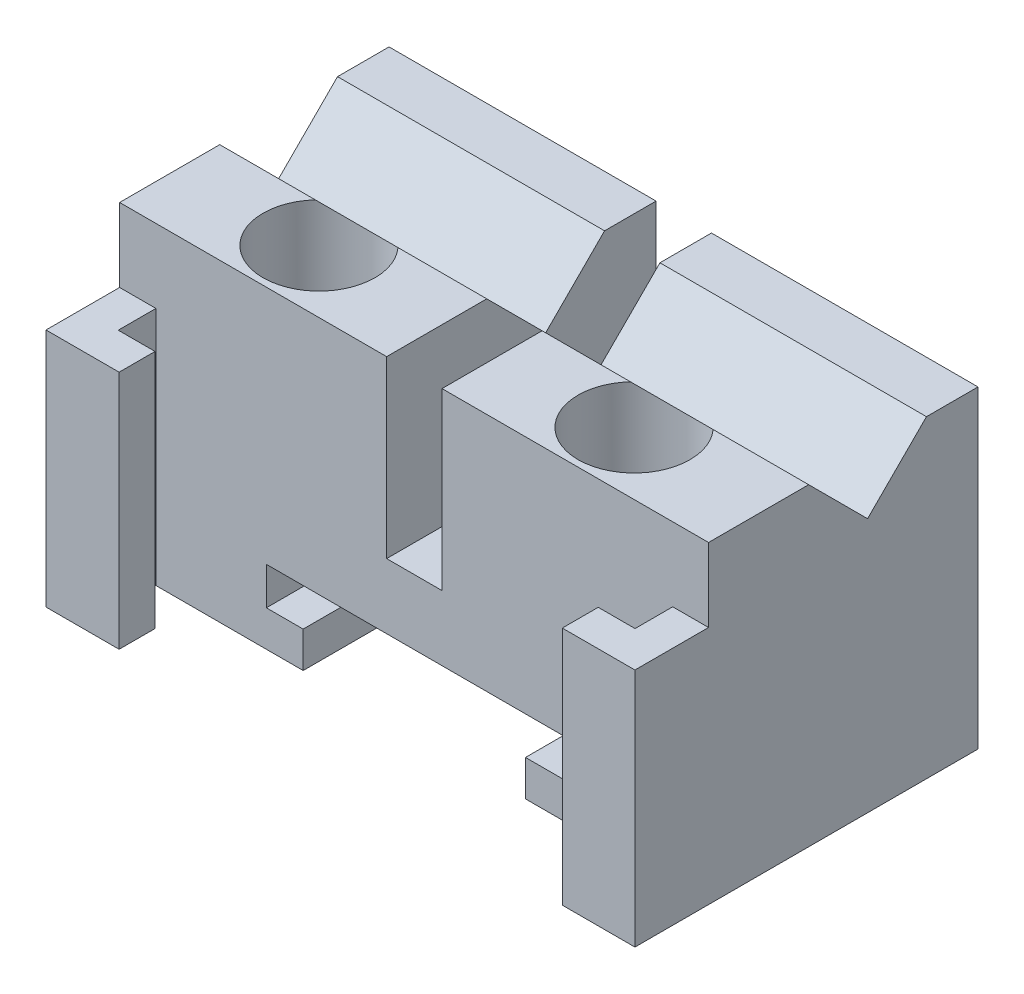
ISO-10303-21;
HEADER;
FILE_DESCRIPTION(('STEP AP214'),'2;1');
FILE_NAME('part.step','',(''),(''),'','','');
FILE_SCHEMA(('AUTOMOTIVE_DESIGN { 1 0 10303 214 1 1 1 1 }'));
ENDSEC;
DATA;
#1=APPLICATION_CONTEXT('core data for automotive mechanical design processes');
#2=APPLICATION_PROTOCOL_DEFINITION('international standard','automotive_design',2000,#1);
#3=PRODUCT_CONTEXT('',#1,'mechanical');
#4=PRODUCT('Part','Part','',(#3));
#5=PRODUCT_RELATED_PRODUCT_CATEGORY('part','',(#4));
#6=PRODUCT_DEFINITION_FORMATION('','',#4);
#7=PRODUCT_DEFINITION_CONTEXT('part definition',#1,'design');
#8=PRODUCT_DEFINITION('design','',#6,#7);
#9=PRODUCT_DEFINITION_SHAPE('','',#8);
#10=(LENGTH_UNIT() NAMED_UNIT(*) SI_UNIT(.MILLI.,.METRE.));
#11=(NAMED_UNIT(*) PLANE_ANGLE_UNIT() SI_UNIT($,.RADIAN.));
#12=(NAMED_UNIT(*) SI_UNIT($,.STERADIAN.) SOLID_ANGLE_UNIT());
#13=UNCERTAINTY_MEASURE_WITH_UNIT(LENGTH_MEASURE(1.E-05),#10,'distance_accuracy_value','');
#14=(GEOMETRIC_REPRESENTATION_CONTEXT(3) GLOBAL_UNCERTAINTY_ASSIGNED_CONTEXT((#13)) GLOBAL_UNIT_ASSIGNED_CONTEXT((#10,
#11,#12)) REPRESENTATION_CONTEXT('',''));
#15=CARTESIAN_POINT('',(0.,0.,0.));
#16=DIRECTION('',(0.,0.,1.));
#17=DIRECTION('',(1.,0.,0.));
#18=AXIS2_PLACEMENT_3D('',#15,#16,#17);
#19=CARTESIAN_POINT('',(-25.4207775733462,13.5045322524581,29.591));
#20=DIRECTION('',(0.,-1.,0.));
#21=DIRECTION('',(0.,0.,-1.));
#22=AXIS2_PLACEMENT_3D('',#19,#20,#21);
#23=PLANE('',#22);
#24=DIRECTION('',(0.,0.,-1.));
#25=VECTOR('',#24,1.);
#26=CARTESIAN_POINT('',(2.38759999997163,13.5045322524581,29.591));
#27=LINE('',#26,#25);
#28=CARTESIAN_POINT('',(2.38759999997162,13.5045322524581,4.44500000000004));
#29=VERTEX_POINT('',#28);
#30=CARTESIAN_POINT('',(2.38759999997163,13.5045322524581,0.));
#31=VERTEX_POINT('',#30);
#32=EDGE_CURVE('E476',#29,#31,#27,.T.);
#33=ORIENTED_EDGE('',*,*,#32,.F.);
#34=DIRECTION('',(1.,0.,0.));
#35=VECTOR('',#34,1.);
#36=CARTESIAN_POINT('',(-25.4207775733462,13.5045322524581,4.44500000000004));
#37=LINE('',#36,#35);
#38=CARTESIAN_POINT('',(25.379222426654,13.5045322524581,4.44500000000004));
#39=VERTEX_POINT('',#38);
#40=EDGE_CURVE('E693',#29,#39,#37,.T.);
#41=ORIENTED_EDGE('',*,*,#40,.T.);
#42=DIRECTION('',(0.,0.,-1.));
#43=VECTOR('',#42,1.);
#44=CARTESIAN_POINT('',(25.379222426654,13.5045322524581,29.591));
#45=LINE('',#44,#43);
#46=CARTESIAN_POINT('',(25.379222426654,13.5045322524581,0.));
#47=VERTEX_POINT('',#46);
#48=EDGE_CURVE('E303',#39,#47,#45,.T.);
#49=ORIENTED_EDGE('',*,*,#48,.T.);
#50=DIRECTION('',(-1.,0.,0.));
#51=VECTOR('',#50,1.);
#52=CARTESIAN_POINT('',(-25.4207775733462,13.5045322524581,0.));
#53=LINE('',#52,#51);
#54=EDGE_CURVE('E313',#47,#31,#53,.T.);
#55=ORIENTED_EDGE('',*,*,#54,.T.);
#56=EDGE_LOOP('',(#33,#41,#49,#55));
#57=FACE_BOUND('',#56,.T.);
#58=ADVANCED_FACE('F51',(#57),#23,.F.);
#59=DIRECTION('',(0.,0.,-1.));
#60=VECTOR('',#59,1.);
#61=CARTESIAN_POINT('',(-25.4207775733462,13.5045322524581,29.591));
#62=LINE('',#61,#60);
#63=CARTESIAN_POINT('',(-25.4207775733462,13.5045322524581,4.44500000000004));
#64=VERTEX_POINT('',#63);
#65=CARTESIAN_POINT('',(-25.4207775733462,13.5045322524581,0.));
#66=VERTEX_POINT('',#65);
#67=EDGE_CURVE('E304',#64,#66,#62,.T.);
#68=ORIENTED_EDGE('',*,*,#67,.F.);
#69=CARTESIAN_POINT('',(-2.3875999999792,13.5045322524581,4.44500000000004));
#70=VERTEX_POINT('',#69);
#71=EDGE_CURVE('E689',#64,#70,#37,.T.);
#72=ORIENTED_EDGE('',*,*,#71,.T.);
#73=DIRECTION('',(0.,0.,-1.));
#74=VECTOR('',#73,1.);
#75=CARTESIAN_POINT('',(-2.38759999997919,13.5045322524581,29.591));
#76=LINE('',#75,#74);
#77=CARTESIAN_POINT('',(-2.38759999997919,13.5045322524581,0.));
#78=VERTEX_POINT('',#77);
#79=EDGE_CURVE('E480',#70,#78,#76,.T.);
#80=ORIENTED_EDGE('',*,*,#79,.T.);
#81=EDGE_CURVE('E559',#78,#66,#53,.T.);
#82=ORIENTED_EDGE('',*,*,#81,.T.);
#83=EDGE_LOOP('',(#68,#72,#80,#82));
#84=FACE_BOUND('',#83,.T.);
#85=ADVANCED_FACE('F725',(#84),#23,.F.);
#86=CARTESIAN_POINT('',(0.,0.,29.591));
#87=DIRECTION('',(0.,0.,1.));
#88=DIRECTION('',(1.,0.,0.));
#89=AXIS2_PLACEMENT_3D('',#86,#87,#88);
#90=PLANE('',#89);
#91=DIRECTION('',(1.,0.,0.));
#92=VECTOR('',#91,1.);
#93=CARTESIAN_POINT('',(-25.4207775733462,7.15453225245807,29.591));
#94=LINE('',#93,#92);
#95=CARTESIAN_POINT('',(-25.4207775733462,7.15453225245807,29.591));
#96=VERTEX_POINT('',#95);
#97=CARTESIAN_POINT('',(-19.1135,7.15453225245807,29.591));
#98=VERTEX_POINT('',#97);
#99=EDGE_CURVE('E657',#96,#98,#94,.T.);
#100=ORIENTED_EDGE('',*,*,#99,.F.);
#101=DIRECTION('',(0.,-1.,0.));
#102=VECTOR('',#101,1.);
#103=CARTESIAN_POINT('',(-25.4207775733462,13.5045322524581,29.591));
#104=LINE('',#103,#102);
#105=CARTESIAN_POINT('',(-25.4207775733462,-13.5464677475419,29.591));
#106=VERTEX_POINT('',#105);
#107=EDGE_CURVE('E538',#96,#106,#104,.T.);
#108=ORIENTED_EDGE('',*,*,#107,.T.);
#109=DIRECTION('',(1.,0.,0.));
#110=VECTOR('',#109,1.);
#111=CARTESIAN_POINT('',(-25.4207775733462,-13.5464677475419,29.591));
#112=LINE('',#111,#110);
#113=CARTESIAN_POINT('',(-19.1135,-13.5464677475419,29.591));
#114=VERTEX_POINT('',#113);
#115=EDGE_CURVE('E542',#106,#114,#112,.T.);
#116=ORIENTED_EDGE('',*,*,#115,.T.);
#117=DIRECTION('',(0.,1.,0.));
#118=VECTOR('',#117,1.);
#119=CARTESIAN_POINT('',(-19.1135,-13.5464677475419,29.591));
#120=LINE('',#119,#118);
#121=EDGE_CURVE('E389',#114,#98,#120,.T.);
#122=ORIENTED_EDGE('',*,*,#121,.T.);
#123=EDGE_LOOP('',(#100,#108,#116,#122));
#124=FACE_BOUND('',#123,.T.);
#125=ADVANCED_FACE('F743',(#124),#90,.T.);
#126=CARTESIAN_POINT('',(25.379222426654,13.5045322524581,23.241));
#127=VERTEX_POINT('',#126);
#128=CARTESIAN_POINT('',(25.379222426654,13.5045322524581,14.605));
#129=VERTEX_POINT('',#128);
#130=EDGE_CURVE('E309',#127,#129,#45,.T.);
#131=ORIENTED_EDGE('',*,*,#130,.T.);
#132=DIRECTION('',(1.,0.,0.));
#133=VECTOR('',#132,1.);
#134=CARTESIAN_POINT('',(-25.4207775733462,13.5045322524581,14.605));
#135=LINE('',#134,#133);
#136=CARTESIAN_POINT('',(17.1347297601665,13.5045322524581,14.605));
#137=VERTEX_POINT('',#136);
#138=EDGE_CURVE('E297',#137,#129,#135,.T.);
#139=ORIENTED_EDGE('',*,*,#138,.F.);
#140=CARTESIAN_POINT('',(13.5682224266538,13.5045322524581,17.8562));
#141=DIRECTION('',(0.,1.,0.));
#142=DIRECTION('',(0.,0.,1.));
#143=AXIS2_PLACEMENT_3D('',#140,#141,#142);
#144=CIRCLE('',#143,4.826);
#145=CARTESIAN_POINT('',(10.0017150931412,13.5045322524581,14.605));
#146=VERTEX_POINT('',#145);
#147=EDGE_CURVE('E339',#146,#137,#144,.T.);
#148=ORIENTED_EDGE('',*,*,#147,.F.);
#149=CARTESIAN_POINT('',(2.38759999997162,13.5045322524581,14.605));
#150=VERTEX_POINT('',#149);
#151=EDGE_CURVE('E75',#150,#146,#135,.T.);
#152=ORIENTED_EDGE('',*,*,#151,.F.);
#153=CARTESIAN_POINT('',(2.38759999997163,13.5045322524581,23.241));
#154=VERTEX_POINT('',#153);
#155=EDGE_CURVE('E472',#154,#150,#27,.T.);
#156=ORIENTED_EDGE('',*,*,#155,.F.);
#157=DIRECTION('',(-1.,0.,0.));
#158=VECTOR('',#157,1.);
#159=CARTESIAN_POINT('',(22.2885,13.5045322524581,23.241));
#160=LINE('',#159,#158);
#161=EDGE_CURVE('E364',#127,#154,#160,.T.);
#162=ORIENTED_EDGE('',*,*,#161,.F.);
#163=EDGE_LOOP('',(#131,#139,#148,#152,#156,#162));
#164=FACE_BOUND('',#163,.T.);
#165=ADVANCED_FACE('F342',(#164),#23,.F.);
#166=CARTESIAN_POINT('',(-25.4207775733462,-13.5464677475419,29.591));
#167=DIRECTION('',(0.,1.,0.));
#168=DIRECTION('',(0.,0.,1.));
#169=AXIS2_PLACEMENT_3D('',#166,#167,#168);
#170=PLANE('',#169);
#171=DIRECTION('',(1.,0.,0.));
#172=VECTOR('',#171,1.);
#173=CARTESIAN_POINT('',(-22.2885,-13.5464677475419,26.4922));
#174=LINE('',#173,#172);
#175=CARTESIAN_POINT('',(-22.2885,-13.5464677475419,26.4922));
#176=VERTEX_POINT('',#175);
#177=CARTESIAN_POINT('',(-19.1135,-13.5464677475419,26.4922));
#178=VERTEX_POINT('',#177);
#179=EDGE_CURVE('E385',#176,#178,#174,.T.);
#180=ORIENTED_EDGE('',*,*,#179,.T.);
#181=DIRECTION('',(0.,0.,1.));
#182=VECTOR('',#181,1.);
#183=CARTESIAN_POINT('',(-19.1135,-13.5464677475419,26.4922));
#184=LINE('',#183,#182);
#185=EDGE_CURVE('E359',#178,#114,#184,.T.);
#186=ORIENTED_EDGE('',*,*,#185,.T.);
#187=ORIENTED_EDGE('',*,*,#115,.F.);
#188=DIRECTION('',(0.,0.,-1.));
#189=VECTOR('',#188,1.);
#190=CARTESIAN_POINT('',(-25.4207775733462,-13.5464677475419,29.591));
#191=LINE('',#190,#189);
#192=CARTESIAN_POINT('',(-25.4207775733462,-13.5464677475419,0.));
#193=VERTEX_POINT('',#192);
#194=EDGE_CURVE('E322',#106,#193,#191,.T.);
#195=ORIENTED_EDGE('',*,*,#194,.T.);
#196=DIRECTION('',(1.,0.,0.));
#197=VECTOR('',#196,1.);
#198=CARTESIAN_POINT('',(-25.4207775733462,-13.5464677475419,0.));
#199=LINE('',#198,#197);
#200=CARTESIAN_POINT('',(-9.5885,-13.5464677475419,0.));
#201=VERTEX_POINT('',#200);
#202=EDGE_CURVE('E553',#193,#201,#199,.T.);
#203=ORIENTED_EDGE('',*,*,#202,.T.);
#204=DIRECTION('',(0.,0.,-1.));
#205=VECTOR('',#204,1.);
#206=CARTESIAN_POINT('',(-9.5885,-13.5464677475419,29.591));
#207=LINE('',#206,#205);
#208=CARTESIAN_POINT('',(-9.58850000000001,-13.5464677475419,23.241));
#209=VERTEX_POINT('',#208);
#210=EDGE_CURVE('E527',#209,#201,#207,.T.);
#211=ORIENTED_EDGE('',*,*,#210,.F.);
#212=DIRECTION('',(-1.,0.,0.));
#213=VECTOR('',#212,1.);
#214=CARTESIAN_POINT('',(22.2885,-13.5464677475419,23.241));
#215=LINE('',#214,#213);
#216=CARTESIAN_POINT('',(-22.2885,-13.5464677475419,23.241));
#217=VERTEX_POINT('',#216);
#218=EDGE_CURVE('E376',#209,#217,#215,.T.);
#219=ORIENTED_EDGE('',*,*,#218,.T.);
#220=DIRECTION('',(0.,0.,1.));
#221=VECTOR('',#220,1.);
#222=CARTESIAN_POINT('',(-22.2885,-13.5464677475419,23.241));
#223=LINE('',#222,#221);
#224=EDGE_CURVE('E381',#217,#176,#223,.T.);
#225=ORIENTED_EDGE('',*,*,#224,.T.);
#226=EDGE_LOOP('',(#180,#186,#187,#195,#203,#211,#219,#225));
#227=FACE_BOUND('',#226,.T.);
#228=ADVANCED_FACE('F757',(#227),#170,.F.);
#229=CARTESIAN_POINT('',(-25.4207775733462,13.5045322524581,29.591));
#230=DIRECTION('',(1.,0.,0.));
#231=DIRECTION('',(0.,0.,-1.));
#232=AXIS2_PLACEMENT_3D('',#229,#230,#231);
#233=PLANE('',#232);
#234=DIRECTION('',(0.,-0.70710678118655,-0.707106781186545));
#235=VECTOR('',#234,1.);
#236=CARTESIAN_POINT('',(-25.4207775733462,-0.55023387377099,0.550233873770993));
#237=LINE('',#236,#235);
#238=CARTESIAN_POINT('',(-25.4207775733462,13.5045322524581,14.605));
#239=VERTEX_POINT('',#238);
#240=CARTESIAN_POINT('',(-25.4207775733462,8.42453225245807,9.525));
#241=VERTEX_POINT('',#240);
#242=EDGE_CURVE('E271',#239,#241,#237,.T.);
#243=ORIENTED_EDGE('',*,*,#242,.T.);
#244=DIRECTION('',(0.,0.70710678118655,-0.707106781186545));
#245=VECTOR('',#244,1.);
#246=CARTESIAN_POINT('',(-25.4207775733462,8.97476612622901,8.97476612622907));
#247=LINE('',#246,#245);
#248=EDGE_CURVE('E280',#241,#64,#247,.T.);
#249=ORIENTED_EDGE('',*,*,#248,.T.);
#250=ORIENTED_EDGE('',*,*,#67,.T.);
#251=DIRECTION('',(0.,-1.,0.));
#252=VECTOR('',#251,1.);
#253=CARTESIAN_POINT('',(-25.4207775733462,13.5045322524581,0.));
#254=LINE('',#253,#252);
#255=EDGE_CURVE('E517',#66,#193,#254,.T.);
#256=ORIENTED_EDGE('',*,*,#255,.T.);
#257=ORIENTED_EDGE('',*,*,#194,.F.);
#258=ORIENTED_EDGE('',*,*,#107,.F.);
#259=DIRECTION('',(0.,0.,-1.));
#260=VECTOR('',#259,1.);
#261=CARTESIAN_POINT('',(-25.4207775733462,7.15453225245807,29.591));
#262=LINE('',#261,#260);
#263=CARTESIAN_POINT('',(-25.4207775733462,7.15453225245807,23.241));
#264=VERTEX_POINT('',#263);
#265=EDGE_CURVE('E669',#96,#264,#262,.T.);
#266=ORIENTED_EDGE('',*,*,#265,.T.);
#267=DIRECTION('',(0.,1.,0.));
#268=VECTOR('',#267,1.);
#269=CARTESIAN_POINT('',(-25.4207775733462,13.5045322524581,23.241));
#270=LINE('',#269,#268);
#271=CARTESIAN_POINT('',(-25.4207775733462,13.5045322524581,23.241));
#272=VERTEX_POINT('',#271);
#273=EDGE_CURVE('E301',#264,#272,#270,.T.);
#274=ORIENTED_EDGE('',*,*,#273,.T.);
#275=EDGE_CURVE('E289',#272,#239,#62,.T.);
#276=ORIENTED_EDGE('',*,*,#275,.T.);
#277=EDGE_LOOP('',(#243,#249,#250,#256,#257,#258,#266,#274,#276));
#278=FACE_BOUND('',#277,.T.);
#279=ADVANCED_FACE('F53',(#278),#233,.F.);
#280=DIRECTION('',(0.,0.,-1.));
#281=VECTOR('',#280,1.);
#282=CARTESIAN_POINT('',(22.2885,-13.5464677475419,26.4922));
#283=LINE('',#282,#281);
#284=CARTESIAN_POINT('',(22.2885,-13.5464677475419,26.4922));
#285=VERTEX_POINT('',#284);
#286=CARTESIAN_POINT('',(22.2885,-13.5464677475419,23.241));
#287=VERTEX_POINT('',#286);
#288=EDGE_CURVE('E372',#285,#287,#283,.T.);
#289=ORIENTED_EDGE('',*,*,#288,.T.);
#290=CARTESIAN_POINT('',(9.5885,-13.5464677475419,23.241));
#291=VERTEX_POINT('',#290);
#292=EDGE_CURVE('E377',#287,#291,#215,.T.);
#293=ORIENTED_EDGE('',*,*,#292,.T.);
#294=DIRECTION('',(0.,0.,-1.));
#295=VECTOR('',#294,1.);
#296=CARTESIAN_POINT('',(9.5885,-13.5464677475419,29.591));
#297=LINE('',#296,#295);
#298=CARTESIAN_POINT('',(9.5885,-13.5464677475419,0.));
#299=VERTEX_POINT('',#298);
#300=EDGE_CURVE('E530',#291,#299,#297,.T.);
#301=ORIENTED_EDGE('',*,*,#300,.T.);
#302=CARTESIAN_POINT('',(25.379222426654,-13.5464677475419,0.));
#303=VERTEX_POINT('',#302);
#304=EDGE_CURVE('E552',#299,#303,#199,.T.);
#305=ORIENTED_EDGE('',*,*,#304,.T.);
#306=DIRECTION('',(0.,0.,-1.));
#307=VECTOR('',#306,1.);
#308=CARTESIAN_POINT('',(25.379222426654,-13.5464677475419,29.591));
#309=LINE('',#308,#307);
#310=CARTESIAN_POINT('',(25.379222426654,-13.5464677475419,29.591));
#311=VERTEX_POINT('',#310);
#312=EDGE_CURVE('E318',#311,#303,#309,.T.);
#313=ORIENTED_EDGE('',*,*,#312,.F.);
#314=CARTESIAN_POINT('',(19.1135,-13.5464677475419,29.591));
#315=VERTEX_POINT('',#314);
#316=EDGE_CURVE('E541',#315,#311,#112,.T.);
#317=ORIENTED_EDGE('',*,*,#316,.F.);
#318=DIRECTION('',(0.,0.,-1.));
#319=VECTOR('',#318,1.);
#320=CARTESIAN_POINT('',(19.1135,-13.5464677475419,29.591));
#321=LINE('',#320,#319);
#322=CARTESIAN_POINT('',(19.1135,-13.5464677475419,26.4922));
#323=VERTEX_POINT('',#322);
#324=EDGE_CURVE('E363',#315,#323,#321,.T.);
#325=ORIENTED_EDGE('',*,*,#324,.T.);
#326=DIRECTION('',(1.,0.,0.));
#327=VECTOR('',#326,1.);
#328=CARTESIAN_POINT('',(19.1135,-13.5464677475419,26.4922));
#329=LINE('',#328,#327);
#330=EDGE_CURVE('E368',#323,#285,#329,.T.);
#331=ORIENTED_EDGE('',*,*,#330,.T.);
#332=EDGE_LOOP('',(#289,#293,#301,#305,#313,#317,#325,#331));
#333=FACE_BOUND('',#332,.T.);
#334=ADVANCED_FACE('F755',(#333),#170,.F.);
#335=CARTESIAN_POINT('',(25.379222426654,13.5045322524581,29.591));
#336=DIRECTION('',(-1.,0.,0.));
#337=DIRECTION('',(0.,0.,1.));
#338=AXIS2_PLACEMENT_3D('',#335,#336,#337);
#339=PLANE('',#338);
#340=ORIENTED_EDGE('',*,*,#48,.F.);
#341=DIRECTION('',(0.,0.70710678118655,-0.707106781186545));
#342=VECTOR('',#341,1.);
#343=CARTESIAN_POINT('',(25.379222426654,8.97476612622901,8.97476612622907));
#344=LINE('',#343,#342);
#345=CARTESIAN_POINT('',(25.379222426654,8.42453225245807,9.525));
#346=VERTEX_POINT('',#345);
#347=EDGE_CURVE('E281',#346,#39,#344,.T.);
#348=ORIENTED_EDGE('',*,*,#347,.F.);
#349=DIRECTION('',(0.,-0.70710678118655,-0.707106781186545));
#350=VECTOR('',#349,1.);
#351=CARTESIAN_POINT('',(25.379222426654,-0.55023387377099,0.550233873770993));
#352=LINE('',#351,#350);
#353=EDGE_CURVE('E699',#129,#346,#352,.T.);
#354=ORIENTED_EDGE('',*,*,#353,.F.);
#355=ORIENTED_EDGE('',*,*,#130,.F.);
#356=DIRECTION('',(0.,1.,0.));
#357=VECTOR('',#356,1.);
#358=CARTESIAN_POINT('',(25.379222426654,13.5045322524581,23.241));
#359=LINE('',#358,#357);
#360=CARTESIAN_POINT('',(25.379222426654,7.15453225245807,23.241));
#361=VERTEX_POINT('',#360);
#362=EDGE_CURVE('E665',#361,#127,#359,.T.);
#363=ORIENTED_EDGE('',*,*,#362,.F.);
#364=DIRECTION('',(0.,0.,-1.));
#365=VECTOR('',#364,1.);
#366=CARTESIAN_POINT('',(25.379222426654,7.15453225245807,29.591));
#367=LINE('',#366,#365);
#368=CARTESIAN_POINT('',(25.379222426654,7.15453225245807,29.591));
#369=VERTEX_POINT('',#368);
#370=EDGE_CURVE('E670',#369,#361,#367,.T.);
#371=ORIENTED_EDGE('',*,*,#370,.F.);
#372=DIRECTION('',(0.,1.,0.));
#373=VECTOR('',#372,1.);
#374=CARTESIAN_POINT('',(25.379222426654,13.5045322524581,29.591));
#375=LINE('',#374,#373);
#376=EDGE_CURVE('E311',#311,#369,#375,.T.);
#377=ORIENTED_EDGE('',*,*,#376,.F.);
#378=ORIENTED_EDGE('',*,*,#312,.T.);
#379=DIRECTION('',(0.,1.,0.));
#380=VECTOR('',#379,1.);
#381=CARTESIAN_POINT('',(25.379222426654,13.5045322524581,0.));
#382=LINE('',#381,#380);
#383=EDGE_CURVE('E556',#303,#47,#382,.T.);
#384=ORIENTED_EDGE('',*,*,#383,.T.);
#385=EDGE_LOOP('',(#340,#348,#354,#355,#363,#371,#377,#378,#384));
#386=FACE_BOUND('',#385,.T.);
#387=ADVANCED_FACE('F748',(#386),#339,.F.);
#388=CARTESIAN_POINT('',(-2.38759999997919,13.5045322524581,23.241));
#389=VERTEX_POINT('',#388);
#390=CARTESIAN_POINT('',(-2.3875999999792,13.5045322524581,14.605));
#391=VERTEX_POINT('',#390);
#392=EDGE_CURVE('E477',#389,#391,#76,.T.);
#393=ORIENTED_EDGE('',*,*,#392,.T.);
#394=CARTESIAN_POINT('',(-10.0432702398335,13.5045322524581,14.605));
#395=VERTEX_POINT('',#394);
#396=EDGE_CURVE('E295',#395,#391,#135,.T.);
#397=ORIENTED_EDGE('',*,*,#396,.F.);
#398=CARTESIAN_POINT('',(-13.6097775733462,13.5045322524581,17.8562));
#399=DIRECTION('',(0.,1.,0.));
#400=DIRECTION('',(0.,0.,1.));
#401=AXIS2_PLACEMENT_3D('',#398,#399,#400);
#402=CIRCLE('',#401,4.826);
#403=CARTESIAN_POINT('',(-17.1762849068589,13.5045322524581,14.605));
#404=VERTEX_POINT('',#403);
#405=EDGE_CURVE('E292',#404,#395,#402,.T.);
#406=ORIENTED_EDGE('',*,*,#405,.F.);
#407=EDGE_CURVE('E67',#239,#404,#135,.T.);
#408=ORIENTED_EDGE('',*,*,#407,.F.);
#409=ORIENTED_EDGE('',*,*,#275,.F.);
#410=EDGE_CURVE('E393',#389,#272,#160,.T.);
#411=ORIENTED_EDGE('',*,*,#410,.F.);
#412=EDGE_LOOP('',(#393,#397,#406,#408,#409,#411));
#413=FACE_BOUND('',#412,.T.);
#414=ADVANCED_FACE('F287',(#413),#23,.F.);
#415=CARTESIAN_POINT('',(19.1135,7.15453225245807,29.591));
#416=VERTEX_POINT('',#415);
#417=EDGE_CURVE('E661',#416,#369,#94,.T.);
#418=ORIENTED_EDGE('',*,*,#417,.F.);
#419=DIRECTION('',(0.,1.,0.));
#420=VECTOR('',#419,1.);
#421=CARTESIAN_POINT('',(19.1135,-13.5464677475419,29.591));
#422=LINE('',#421,#420);
#423=EDGE_CURVE('E419',#315,#416,#422,.T.);
#424=ORIENTED_EDGE('',*,*,#423,.F.);
#425=ORIENTED_EDGE('',*,*,#316,.T.);
#426=ORIENTED_EDGE('',*,*,#376,.T.);
#427=EDGE_LOOP('',(#418,#424,#425,#426));
#428=FACE_BOUND('',#427,.T.);
#429=ADVANCED_FACE('F747',(#428),#90,.T.);
#430=CARTESIAN_POINT('',(0.,0.,0.));
#431=DIRECTION('',(0.,0.,1.));
#432=DIRECTION('',(1.,0.,0.));
#433=AXIS2_PLACEMENT_3D('',#430,#431,#432);
#434=PLANE('',#433);
#435=DIRECTION('',(-1.,0.,0.));
#436=VECTOR('',#435,1.);
#437=CARTESIAN_POINT('',(2.38759999997163,-1.58306774754193,0.));
#438=LINE('',#437,#436);
#439=CARTESIAN_POINT('',(2.38759999997163,-1.58306774754193,0.));
#440=VERTEX_POINT('',#439);
#441=CARTESIAN_POINT('',(-2.38759999997919,-1.58306774754193,0.));
#442=VERTEX_POINT('',#441);
#443=EDGE_CURVE('E463',#440,#442,#438,.T.);
#444=ORIENTED_EDGE('',*,*,#443,.F.);
#445=DIRECTION('',(0.,-1.,0.));
#446=VECTOR('',#445,1.);
#447=CARTESIAN_POINT('',(2.38759999997163,13.5045322524581,0.));
#448=LINE('',#447,#446);
#449=EDGE_CURVE('E459',#31,#440,#448,.T.);
#450=ORIENTED_EDGE('',*,*,#449,.F.);
#451=ORIENTED_EDGE('',*,*,#54,.F.);
#452=ORIENTED_EDGE('',*,*,#383,.F.);
#453=ORIENTED_EDGE('',*,*,#304,.F.);
#454=DIRECTION('',(0.,-1.,0.));
#455=VECTOR('',#454,1.);
#456=CARTESIAN_POINT('',(9.5885,-10.4476677475419,0.));
#457=LINE('',#456,#455);
#458=CARTESIAN_POINT('',(9.5885,-10.4476677475419,0.));
#459=VERTEX_POINT('',#458);
#460=EDGE_CURVE('E493',#459,#299,#457,.T.);
#461=ORIENTED_EDGE('',*,*,#460,.F.);
#462=DIRECTION('',(-1.,0.,0.));
#463=VECTOR('',#462,1.);
#464=CARTESIAN_POINT('',(12.7635,-10.4476677475419,0.));
#465=LINE('',#464,#463);
#466=CARTESIAN_POINT('',(12.7635,-10.4476677475419,0.));
#467=VERTEX_POINT('',#466);
#468=EDGE_CURVE('E489',#467,#459,#465,.T.);
#469=ORIENTED_EDGE('',*,*,#468,.F.);
#470=DIRECTION('',(0.,-1.,0.));
#471=VECTOR('',#470,1.);
#472=CARTESIAN_POINT('',(12.7635,-7.19646774754192,0.));
#473=LINE('',#472,#471);
#474=CARTESIAN_POINT('',(12.7635,-7.19646774754192,0.));
#475=VERTEX_POINT('',#474);
#476=EDGE_CURVE('E475',#475,#467,#473,.T.);
#477=ORIENTED_EDGE('',*,*,#476,.F.);
#478=DIRECTION('',(1.,0.,0.));
#479=VECTOR('',#478,1.);
#480=CARTESIAN_POINT('',(12.7635,-7.19646774754192,0.));
#481=LINE('',#480,#479);
#482=CARTESIAN_POINT('',(-12.7635,-7.19646774754192,0.));
#483=VERTEX_POINT('',#482);
#484=EDGE_CURVE('E509',#483,#475,#481,.T.);
#485=ORIENTED_EDGE('',*,*,#484,.F.);
#486=DIRECTION('',(0.,1.,0.));
#487=VECTOR('',#486,1.);
#488=CARTESIAN_POINT('',(-12.7635,-10.4476677475419,0.));
#489=LINE('',#488,#487);
#490=CARTESIAN_POINT('',(-12.7635,-10.4476677475419,0.));
#491=VERTEX_POINT('',#490);
#492=EDGE_CURVE('E505',#491,#483,#489,.T.);
#493=ORIENTED_EDGE('',*,*,#492,.F.);
#494=DIRECTION('',(-1.,0.,0.));
#495=VECTOR('',#494,1.);
#496=CARTESIAN_POINT('',(-9.5885,-10.4476677475419,0.));
#497=LINE('',#496,#495);
#498=CARTESIAN_POINT('',(-9.5885,-10.4476677475419,0.));
#499=VERTEX_POINT('',#498);
#500=EDGE_CURVE('E501',#499,#491,#497,.T.);
#501=ORIENTED_EDGE('',*,*,#500,.F.);
#502=DIRECTION('',(0.,1.,0.));
#503=VECTOR('',#502,1.);
#504=CARTESIAN_POINT('',(-9.5885,-13.5464677475419,0.));
#505=LINE('',#504,#503);
#506=EDGE_CURVE('E497',#201,#499,#505,.T.);
#507=ORIENTED_EDGE('',*,*,#506,.F.);
#508=ORIENTED_EDGE('',*,*,#202,.F.);
#509=ORIENTED_EDGE('',*,*,#255,.F.);
#510=ORIENTED_EDGE('',*,*,#81,.F.);
#511=DIRECTION('',(0.,1.,0.));
#512=VECTOR('',#511,1.);
#513=CARTESIAN_POINT('',(-2.38759999997919,13.5045322524581,0.));
#514=LINE('',#513,#512);
#515=EDGE_CURVE('E467',#442,#78,#514,.T.);
#516=ORIENTED_EDGE('',*,*,#515,.F.);
#517=EDGE_LOOP('',(#444,#450,#451,#452,#453,#461,#469,#477,#485,#493,#501,#507,#508,#509,#510,#516));
#518=FACE_BOUND('',#517,.T.);
#519=ADVANCED_FACE('F581',(#518),#434,.F.);
#520=CARTESIAN_POINT('',(12.7635,-7.19646774754192,29.591));
#521=DIRECTION('',(1.,0.,0.));
#522=DIRECTION('',(0.,0.,-1.));
#523=AXIS2_PLACEMENT_3D('',#520,#521,#522);
#524=PLANE('',#523);
#525=DIRECTION('',(0.,0.,-1.));
#526=VECTOR('',#525,1.);
#527=CARTESIAN_POINT('',(12.7635,-10.4476677475419,29.591));
#528=LINE('',#527,#526);
#529=CARTESIAN_POINT('',(12.7635,-10.4476677475419,23.241));
#530=VERTEX_POINT('',#529);
#531=EDGE_CURVE('E513',#530,#467,#528,.T.);
#532=ORIENTED_EDGE('',*,*,#531,.F.);
#533=DIRECTION('',(0.,1.,0.));
#534=VECTOR('',#533,1.);
#535=CARTESIAN_POINT('',(12.7635,-7.19646774754192,23.241));
#536=LINE('',#535,#534);
#537=CARTESIAN_POINT('',(12.7635,-7.19646774754192,23.241));
#538=VERTEX_POINT('',#537);
#539=EDGE_CURVE('E439',#530,#538,#536,.T.);
#540=ORIENTED_EDGE('',*,*,#539,.T.);
#541=DIRECTION('',(0.,0.,-1.));
#542=VECTOR('',#541,1.);
#543=CARTESIAN_POINT('',(12.7635,-7.19646774754192,29.591));
#544=LINE('',#543,#542);
#545=EDGE_CURVE('E514',#538,#475,#544,.T.);
#546=ORIENTED_EDGE('',*,*,#545,.T.);
#547=ORIENTED_EDGE('',*,*,#476,.T.);
#548=EDGE_LOOP('',(#532,#540,#546,#547));
#549=FACE_BOUND('',#548,.T.);
#550=ADVANCED_FACE('F768',(#549),#524,.F.);
#551=CARTESIAN_POINT('',(12.7635,-7.19646774754192,29.591));
#552=DIRECTION('',(0.,1.,0.));
#553=DIRECTION('',(0.,0.,1.));
#554=AXIS2_PLACEMENT_3D('',#551,#552,#553);
#555=PLANE('',#554);
#556=ORIENTED_EDGE('',*,*,#545,.F.);
#557=DIRECTION('',(-1.,0.,0.));
#558=VECTOR('',#557,1.);
#559=CARTESIAN_POINT('',(12.7635,-7.19646774754192,23.241));
#560=LINE('',#559,#558);
#561=CARTESIAN_POINT('',(-12.7635,-7.19646774754192,23.241));
#562=VERTEX_POINT('',#561);
#563=EDGE_CURVE('E443',#538,#562,#560,.T.);
#564=ORIENTED_EDGE('',*,*,#563,.T.);
#565=DIRECTION('',(0.,0.,-1.));
#566=VECTOR('',#565,1.);
#567=CARTESIAN_POINT('',(-12.7635,-7.19646774754192,29.591));
#568=LINE('',#567,#566);
#569=EDGE_CURVE('E518',#562,#483,#568,.T.);
#570=ORIENTED_EDGE('',*,*,#569,.T.);
#571=ORIENTED_EDGE('',*,*,#484,.T.);
#572=EDGE_LOOP('',(#556,#564,#570,#571));
#573=FACE_BOUND('',#572,.T.);
#574=ADVANCED_FACE('F774',(#573),#555,.F.);
#575=CARTESIAN_POINT('',(-12.7635,-10.4476677475419,29.591));
#576=DIRECTION('',(-1.,0.,0.));
#577=DIRECTION('',(0.,0.,1.));
#578=AXIS2_PLACEMENT_3D('',#575,#576,#577);
#579=PLANE('',#578);
#580=ORIENTED_EDGE('',*,*,#569,.F.);
#581=DIRECTION('',(0.,-1.,0.));
#582=VECTOR('',#581,1.);
#583=CARTESIAN_POINT('',(-12.7635,-10.4476677475419,23.241));
#584=LINE('',#583,#582);
#585=CARTESIAN_POINT('',(-12.7635,-10.4476677475419,23.241));
#586=VERTEX_POINT('',#585);
#587=EDGE_CURVE('E447',#562,#586,#584,.T.);
#588=ORIENTED_EDGE('',*,*,#587,.T.);
#589=DIRECTION('',(0.,0.,-1.));
#590=VECTOR('',#589,1.);
#591=CARTESIAN_POINT('',(-12.7635,-10.4476677475419,29.591));
#592=LINE('',#591,#590);
#593=EDGE_CURVE('E521',#586,#491,#592,.T.);
#594=ORIENTED_EDGE('',*,*,#593,.T.);
#595=ORIENTED_EDGE('',*,*,#492,.T.);
#596=EDGE_LOOP('',(#580,#588,#594,#595));
#597=FACE_BOUND('',#596,.T.);
#598=ADVANCED_FACE('F779',(#597),#579,.F.);
#599=CARTESIAN_POINT('',(-9.5885,-10.4476677475419,29.591));
#600=DIRECTION('',(0.,-1.,0.));
#601=DIRECTION('',(0.,0.,-1.));
#602=AXIS2_PLACEMENT_3D('',#599,#600,#601);
#603=PLANE('',#602);
#604=ORIENTED_EDGE('',*,*,#593,.F.);
#605=DIRECTION('',(1.,0.,0.));
#606=VECTOR('',#605,1.);
#607=CARTESIAN_POINT('',(-9.58850000000001,-10.4476677475419,23.241));
#608=LINE('',#607,#606);
#609=CARTESIAN_POINT('',(-9.5885,-10.4476677475419,23.241));
#610=VERTEX_POINT('',#609);
#611=EDGE_CURVE('E451',#586,#610,#608,.T.);
#612=ORIENTED_EDGE('',*,*,#611,.T.);
#613=DIRECTION('',(0.,0.,-1.));
#614=VECTOR('',#613,1.);
#615=CARTESIAN_POINT('',(-9.5885,-10.4476677475419,29.591));
#616=LINE('',#615,#614);
#617=EDGE_CURVE('E524',#610,#499,#616,.T.);
#618=ORIENTED_EDGE('',*,*,#617,.T.);
#619=ORIENTED_EDGE('',*,*,#500,.T.);
#620=EDGE_LOOP('',(#604,#612,#618,#619));
#621=FACE_BOUND('',#620,.T.);
#622=ADVANCED_FACE('F891',(#621),#603,.F.);
#623=CARTESIAN_POINT('',(-9.5885,-13.5464677475419,29.591));
#624=DIRECTION('',(-1.,0.,0.));
#625=DIRECTION('',(0.,0.,1.));
#626=AXIS2_PLACEMENT_3D('',#623,#624,#625);
#627=PLANE('',#626);
#628=ORIENTED_EDGE('',*,*,#617,.F.);
#629=DIRECTION('',(0.,-1.,0.));
#630=VECTOR('',#629,1.);
#631=CARTESIAN_POINT('',(-9.5885,-13.5464677475419,23.241));
#632=LINE('',#631,#630);
#633=EDGE_CURVE('E455',#610,#209,#632,.T.);
#634=ORIENTED_EDGE('',*,*,#633,.T.);
#635=ORIENTED_EDGE('',*,*,#210,.T.);
#636=ORIENTED_EDGE('',*,*,#506,.T.);
#637=EDGE_LOOP('',(#628,#634,#635,#636));
#638=FACE_BOUND('',#637,.T.);
#639=ADVANCED_FACE('F895',(#638),#627,.F.);
#640=CARTESIAN_POINT('',(9.5885,-10.4476677475419,29.591));
#641=DIRECTION('',(1.,0.,0.));
#642=DIRECTION('',(0.,0.,-1.));
#643=AXIS2_PLACEMENT_3D('',#640,#641,#642);
#644=PLANE('',#643);
#645=ORIENTED_EDGE('',*,*,#300,.F.);
#646=DIRECTION('',(0.,1.,0.));
#647=VECTOR('',#646,1.);
#648=CARTESIAN_POINT('',(9.5885,-10.4476677475419,23.241));
#649=LINE('',#648,#647);
#650=CARTESIAN_POINT('',(9.5885,-10.4476677475419,23.241));
#651=VERTEX_POINT('',#650);
#652=EDGE_CURVE('E435',#291,#651,#649,.T.);
#653=ORIENTED_EDGE('',*,*,#652,.T.);
#654=DIRECTION('',(0.,0.,-1.));
#655=VECTOR('',#654,1.);
#656=CARTESIAN_POINT('',(9.5885,-10.4476677475419,29.591));
#657=LINE('',#656,#655);
#658=EDGE_CURVE('E533',#651,#459,#657,.T.);
#659=ORIENTED_EDGE('',*,*,#658,.T.);
#660=ORIENTED_EDGE('',*,*,#460,.T.);
#661=EDGE_LOOP('',(#645,#653,#659,#660));
#662=FACE_BOUND('',#661,.T.);
#663=ADVANCED_FACE('F793',(#662),#644,.F.);
#664=CARTESIAN_POINT('',(12.7635,-10.4476677475419,29.591));
#665=DIRECTION('',(0.,-1.,0.));
#666=DIRECTION('',(1.,0.,0.));
#667=AXIS2_PLACEMENT_3D('',#664,#665,#666);
#668=PLANE('',#667);
#669=ORIENTED_EDGE('',*,*,#658,.F.);
#670=DIRECTION('',(1.,0.,0.));
#671=VECTOR('',#670,1.);
#672=CARTESIAN_POINT('',(12.7635,-10.4476677475419,23.241));
#673=LINE('',#672,#671);
#674=EDGE_CURVE('E431',#651,#530,#673,.T.);
#675=ORIENTED_EDGE('',*,*,#674,.T.);
#676=ORIENTED_EDGE('',*,*,#531,.T.);
#677=ORIENTED_EDGE('',*,*,#468,.T.);
#678=EDGE_LOOP('',(#669,#675,#676,#677));
#679=FACE_BOUND('',#678,.T.);
#680=ADVANCED_FACE('F788',(#679),#668,.F.);
#681=CARTESIAN_POINT('',(2.38759999997163,13.5045322524581,29.591));
#682=DIRECTION('',(1.,0.,0.));
#683=DIRECTION('',(0.,0.,-1.));
#684=AXIS2_PLACEMENT_3D('',#681,#682,#683);
#685=PLANE('',#684);
#686=DIRECTION('',(0.,-0.70710678118655,-0.707106781186545));
#687=VECTOR('',#686,1.);
#688=CARTESIAN_POINT('',(2.38759999997163,20.9975322524581,22.0979999999999));
#689=LINE('',#688,#687);
#690=CARTESIAN_POINT('',(2.38759999997162,8.42453225245807,9.525));
#691=VERTEX_POINT('',#690);
#692=EDGE_CURVE('E680',#150,#691,#689,.T.);
#693=ORIENTED_EDGE('',*,*,#692,.T.);
#694=DIRECTION('',(0.,0.70710678118655,-0.707106781186545));
#695=VECTOR('',#694,1.);
#696=CARTESIAN_POINT('',(2.38759999997163,0.931532252458098,17.0179999999999));
#697=LINE('',#696,#695);
#698=EDGE_CURVE('E589',#691,#29,#697,.T.);
#699=ORIENTED_EDGE('',*,*,#698,.T.);
#700=ORIENTED_EDGE('',*,*,#32,.T.);
#701=ORIENTED_EDGE('',*,*,#449,.T.);
#702=DIRECTION('',(0.,0.,-1.));
#703=VECTOR('',#702,1.);
#704=CARTESIAN_POINT('',(2.38759999997163,-1.58306774754193,29.591));
#705=LINE('',#704,#703);
#706=CARTESIAN_POINT('',(2.38759999997163,-1.58306774754193,23.241));
#707=VERTEX_POINT('',#706);
#708=EDGE_CURVE('E471',#707,#440,#705,.T.);
#709=ORIENTED_EDGE('',*,*,#708,.F.);
#710=DIRECTION('',(0.,1.,0.));
#711=VECTOR('',#710,1.);
#712=CARTESIAN_POINT('',(2.38759999997163,13.5045322524581,23.241));
#713=LINE('',#712,#711);
#714=EDGE_CURVE('E428',#707,#154,#713,.T.);
#715=ORIENTED_EDGE('',*,*,#714,.T.);
#716=ORIENTED_EDGE('',*,*,#155,.T.);
#717=EDGE_LOOP('',(#693,#699,#700,#701,#709,#715,#716));
#718=FACE_BOUND('',#717,.T.);
#719=ADVANCED_FACE('F587',(#718),#685,.F.);
#720=CARTESIAN_POINT('',(-2.38759999997919,13.5045322524581,29.591));
#721=DIRECTION('',(-1.,0.,0.));
#722=DIRECTION('',(0.,0.,1.));
#723=AXIS2_PLACEMENT_3D('',#720,#721,#722);
#724=PLANE('',#723);
#725=ORIENTED_EDGE('',*,*,#79,.F.);
#726=DIRECTION('',(0.,-0.70710678118655,0.707106781186545));
#727=VECTOR('',#726,1.);
#728=CARTESIAN_POINT('',(-2.38759999997919,0.931532252458098,17.0179999999999));
#729=LINE('',#728,#727);
#730=CARTESIAN_POINT('',(-2.3875999999792,8.42453225245807,9.525));
#731=VERTEX_POINT('',#730);
#732=EDGE_CURVE('E13',#70,#731,#729,.T.);
#733=ORIENTED_EDGE('',*,*,#732,.T.);
#734=DIRECTION('',(0.,0.70710678118655,0.707106781186545));
#735=VECTOR('',#734,1.);
#736=CARTESIAN_POINT('',(-2.38759999997919,20.9975322524581,22.0979999999999));
#737=LINE('',#736,#735);
#738=EDGE_CURVE('E683',#731,#391,#737,.T.);
#739=ORIENTED_EDGE('',*,*,#738,.T.);
#740=ORIENTED_EDGE('',*,*,#392,.F.);
#741=DIRECTION('',(0.,-1.,0.));
#742=VECTOR('',#741,1.);
#743=CARTESIAN_POINT('',(-2.38759999997919,13.5045322524581,23.241));
#744=LINE('',#743,#742);
#745=CARTESIAN_POINT('',(-2.3875999999792,-1.58306774754193,23.241));
#746=VERTEX_POINT('',#745);
#747=EDGE_CURVE('E398',#389,#746,#744,.T.);
#748=ORIENTED_EDGE('',*,*,#747,.T.);
#749=DIRECTION('',(0.,0.,-1.));
#750=VECTOR('',#749,1.);
#751=CARTESIAN_POINT('',(-2.38759999997919,-1.58306774754193,29.591));
#752=LINE('',#751,#750);
#753=EDGE_CURVE('E481',#746,#442,#752,.T.);
#754=ORIENTED_EDGE('',*,*,#753,.T.);
#755=ORIENTED_EDGE('',*,*,#515,.T.);
#756=EDGE_LOOP('',(#725,#733,#739,#740,#748,#754,#755));
#757=FACE_BOUND('',#756,.T.);
#758=ADVANCED_FACE('F715',(#757),#724,.F.);
#759=CARTESIAN_POINT('',(2.38759999997163,-1.58306774754193,29.591));
#760=DIRECTION('',(0.,-1.,0.));
#761=DIRECTION('',(0.,0.,-1.));
#762=AXIS2_PLACEMENT_3D('',#759,#760,#761);
#763=PLANE('',#762);
#764=ORIENTED_EDGE('',*,*,#753,.F.);
#765=DIRECTION('',(1.,0.,0.));
#766=VECTOR('',#765,1.);
#767=CARTESIAN_POINT('',(2.38759999997163,-1.58306774754193,23.241));
#768=LINE('',#767,#766);
#769=EDGE_CURVE('E326',#746,#707,#768,.T.);
#770=ORIENTED_EDGE('',*,*,#769,.T.);
#771=ORIENTED_EDGE('',*,*,#708,.T.);
#772=ORIENTED_EDGE('',*,*,#443,.T.);
#773=EDGE_LOOP('',(#764,#770,#771,#772));
#774=FACE_BOUND('',#773,.T.);
#775=ADVANCED_FACE('F721',(#774),#763,.F.);
#776=CARTESIAN_POINT('',(22.2885,-13.5464677475419,23.241));
#777=DIRECTION('',(0.,0.,-1.));
#778=DIRECTION('',(-1.,0.,0.));
#779=AXIS2_PLACEMENT_3D('',#776,#777,#778);
#780=PLANE('',#779);
#781=DIRECTION('',(0.,1.,0.));
#782=VECTOR('',#781,1.);
#783=CARTESIAN_POINT('',(22.2885,-13.5464677475419,23.241));
#784=LINE('',#783,#782);
#785=CARTESIAN_POINT('',(22.2885,7.15453225245807,23.241));
#786=VERTEX_POINT('',#785);
#787=EDGE_CURVE('E407',#287,#786,#784,.T.);
#788=ORIENTED_EDGE('',*,*,#787,.T.);
#789=DIRECTION('',(1.,0.,0.));
#790=VECTOR('',#789,1.);
#791=CARTESIAN_POINT('',(-25.4207775733462,7.15453225245807,23.241));
#792=LINE('',#791,#790);
#793=EDGE_CURVE('E660',#786,#361,#792,.T.);
#794=ORIENTED_EDGE('',*,*,#793,.T.);
#795=ORIENTED_EDGE('',*,*,#362,.T.);
#796=ORIENTED_EDGE('',*,*,#161,.T.);
#797=ORIENTED_EDGE('',*,*,#714,.F.);
#798=ORIENTED_EDGE('',*,*,#769,.F.);
#799=ORIENTED_EDGE('',*,*,#747,.F.);
#800=ORIENTED_EDGE('',*,*,#410,.T.);
#801=ORIENTED_EDGE('',*,*,#273,.F.);
#802=CARTESIAN_POINT('',(-22.2885,7.15453225245807,23.241));
#803=VERTEX_POINT('',#802);
#804=EDGE_CURVE('E656',#264,#803,#792,.T.);
#805=ORIENTED_EDGE('',*,*,#804,.T.);
#806=DIRECTION('',(0.,1.,0.));
#807=VECTOR('',#806,1.);
#808=CARTESIAN_POINT('',(-22.2885,-13.5464677475419,23.241));
#809=LINE('',#808,#807);
#810=EDGE_CURVE('E403',#217,#803,#809,.T.);
#811=ORIENTED_EDGE('',*,*,#810,.F.);
#812=ORIENTED_EDGE('',*,*,#218,.F.);
#813=ORIENTED_EDGE('',*,*,#633,.F.);
#814=ORIENTED_EDGE('',*,*,#611,.F.);
#815=ORIENTED_EDGE('',*,*,#587,.F.);
#816=ORIENTED_EDGE('',*,*,#563,.F.);
#817=ORIENTED_EDGE('',*,*,#539,.F.);
#818=ORIENTED_EDGE('',*,*,#674,.F.);
#819=ORIENTED_EDGE('',*,*,#652,.F.);
#820=ORIENTED_EDGE('',*,*,#292,.F.);
#821=EDGE_LOOP('',(#788,#794,#795,#796,#797,#798,#799,#800,#801,#805,#811,#812,#813,#814,#815,
#816,#817,#818,#819,#820));
#822=FACE_BOUND('',#821,.T.);
#823=ADVANCED_FACE('F717',(#822),#780,.F.);
#824=CARTESIAN_POINT('',(-19.1135,-13.5464677475419,26.4922));
#825=DIRECTION('',(-1.,0.,0.));
#826=DIRECTION('',(0.,0.,1.));
#827=AXIS2_PLACEMENT_3D('',#824,#825,#826);
#828=PLANE('',#827);
#829=DIRECTION('',(0.,1.,0.));
#830=VECTOR('',#829,1.);
#831=CARTESIAN_POINT('',(-19.1135,-13.5464677475419,26.4922));
#832=LINE('',#831,#830);
#833=CARTESIAN_POINT('',(-19.1135,7.15453225245807,26.4922));
#834=VERTEX_POINT('',#833);
#835=EDGE_CURVE('E394',#178,#834,#832,.T.);
#836=ORIENTED_EDGE('',*,*,#835,.T.);
#837=DIRECTION('',(0.,0.,1.));
#838=VECTOR('',#837,1.);
#839=CARTESIAN_POINT('',(-19.1135,7.15453225245807,26.4922));
#840=LINE('',#839,#838);
#841=EDGE_CURVE('E347',#834,#98,#840,.T.);
#842=ORIENTED_EDGE('',*,*,#841,.T.);
#843=ORIENTED_EDGE('',*,*,#121,.F.);
#844=ORIENTED_EDGE('',*,*,#185,.F.);
#845=EDGE_LOOP('',(#836,#842,#843,#844));
#846=FACE_BOUND('',#845,.T.);
#847=ADVANCED_FACE('F867',(#846),#828,.F.);
#848=CARTESIAN_POINT('',(-22.2885,-13.5464677475419,26.4922));
#849=DIRECTION('',(0.,0.,1.));
#850=DIRECTION('',(1.,0.,0.));
#851=AXIS2_PLACEMENT_3D('',#848,#849,#850);
#852=PLANE('',#851);
#853=DIRECTION('',(0.,1.,0.));
#854=VECTOR('',#853,1.);
#855=CARTESIAN_POINT('',(-22.2885,-13.5464677475419,26.4922));
#856=LINE('',#855,#854);
#857=CARTESIAN_POINT('',(-22.2885,7.15453225245807,26.4922));
#858=VERTEX_POINT('',#857);
#859=EDGE_CURVE('E399',#176,#858,#856,.T.);
#860=ORIENTED_EDGE('',*,*,#859,.T.);
#861=DIRECTION('',(1.,0.,0.));
#862=VECTOR('',#861,1.);
#863=CARTESIAN_POINT('',(-22.2885,7.15453225245807,26.4922));
#864=LINE('',#863,#862);
#865=EDGE_CURVE('E355',#858,#834,#864,.T.);
#866=ORIENTED_EDGE('',*,*,#865,.T.);
#867=ORIENTED_EDGE('',*,*,#835,.F.);
#868=ORIENTED_EDGE('',*,*,#179,.F.);
#869=EDGE_LOOP('',(#860,#866,#867,#868));
#870=FACE_BOUND('',#869,.T.);
#871=ADVANCED_FACE('F863',(#870),#852,.F.);
#872=CARTESIAN_POINT('',(-22.2885,-13.5464677475419,23.241));
#873=DIRECTION('',(-1.,0.,0.));
#874=DIRECTION('',(0.,0.,1.));
#875=AXIS2_PLACEMENT_3D('',#872,#873,#874);
#876=PLANE('',#875);
#877=ORIENTED_EDGE('',*,*,#810,.T.);
#878=DIRECTION('',(0.,0.,1.));
#879=VECTOR('',#878,1.);
#880=CARTESIAN_POINT('',(-22.2885,7.15453225245807,23.241));
#881=LINE('',#880,#879);
#882=EDGE_CURVE('E644',#803,#858,#881,.T.);
#883=ORIENTED_EDGE('',*,*,#882,.T.);
#884=ORIENTED_EDGE('',*,*,#859,.F.);
#885=ORIENTED_EDGE('',*,*,#224,.F.);
#886=EDGE_LOOP('',(#877,#883,#884,#885));
#887=FACE_BOUND('',#886,.T.);
#888=ADVANCED_FACE('F866',(#887),#876,.F.);
#889=CARTESIAN_POINT('',(22.2885,-13.5464677475419,26.4922));
#890=DIRECTION('',(1.,0.,0.));
#891=DIRECTION('',(0.,0.,-1.));
#892=AXIS2_PLACEMENT_3D('',#889,#890,#891);
#893=PLANE('',#892);
#894=DIRECTION('',(0.,1.,0.));
#895=VECTOR('',#894,1.);
#896=CARTESIAN_POINT('',(22.2885,-13.5464677475419,26.4922));
#897=LINE('',#896,#895);
#898=CARTESIAN_POINT('',(22.2885,7.15453225245807,26.4922));
#899=VERTEX_POINT('',#898);
#900=EDGE_CURVE('E411',#285,#899,#897,.T.);
#901=ORIENTED_EDGE('',*,*,#900,.T.);
#902=DIRECTION('',(0.,0.,-1.));
#903=VECTOR('',#902,1.);
#904=CARTESIAN_POINT('',(22.2885,7.15453225245807,26.4922));
#905=LINE('',#904,#903);
#906=EDGE_CURVE('E648',#899,#786,#905,.T.);
#907=ORIENTED_EDGE('',*,*,#906,.T.);
#908=ORIENTED_EDGE('',*,*,#787,.F.);
#909=ORIENTED_EDGE('',*,*,#288,.F.);
#910=EDGE_LOOP('',(#901,#907,#908,#909));
#911=FACE_BOUND('',#910,.T.);
#912=ADVANCED_FACE('F798',(#911),#893,.F.);
#913=CARTESIAN_POINT('',(19.1135,-13.5464677475419,26.4922));
#914=DIRECTION('',(0.,0.,1.));
#915=DIRECTION('',(1.,0.,0.));
#916=AXIS2_PLACEMENT_3D('',#913,#914,#915);
#917=PLANE('',#916);
#918=DIRECTION('',(0.,1.,0.));
#919=VECTOR('',#918,1.);
#920=CARTESIAN_POINT('',(19.1135,-13.5464677475419,26.4922));
#921=LINE('',#920,#919);
#922=CARTESIAN_POINT('',(19.1135,7.15453225245807,26.4922));
#923=VERTEX_POINT('',#922);
#924=EDGE_CURVE('E415',#323,#923,#921,.T.);
#925=ORIENTED_EDGE('',*,*,#924,.T.);
#926=DIRECTION('',(1.,0.,0.));
#927=VECTOR('',#926,1.);
#928=CARTESIAN_POINT('',(19.1135,7.15453225245807,26.4922));
#929=LINE('',#928,#927);
#930=EDGE_CURVE('E652',#923,#899,#929,.T.);
#931=ORIENTED_EDGE('',*,*,#930,.T.);
#932=ORIENTED_EDGE('',*,*,#900,.F.);
#933=ORIENTED_EDGE('',*,*,#330,.F.);
#934=EDGE_LOOP('',(#925,#931,#932,#933));
#935=FACE_BOUND('',#934,.T.);
#936=ADVANCED_FACE('F802',(#935),#917,.F.);
#937=CARTESIAN_POINT('',(19.1135,-13.5464677475419,29.591));
#938=DIRECTION('',(1.,0.,0.));
#939=DIRECTION('',(0.,0.,-1.));
#940=AXIS2_PLACEMENT_3D('',#937,#938,#939);
#941=PLANE('',#940);
#942=ORIENTED_EDGE('',*,*,#423,.T.);
#943=DIRECTION('',(0.,0.,-1.));
#944=VECTOR('',#943,1.);
#945=CARTESIAN_POINT('',(19.1135,7.15453225245807,29.591));
#946=LINE('',#945,#944);
#947=EDGE_CURVE('E330',#416,#923,#946,.T.);
#948=ORIENTED_EDGE('',*,*,#947,.T.);
#949=ORIENTED_EDGE('',*,*,#924,.F.);
#950=ORIENTED_EDGE('',*,*,#324,.F.);
#951=EDGE_LOOP('',(#942,#948,#949,#950));
#952=FACE_BOUND('',#951,.T.);
#953=ADVANCED_FACE('F805',(#952),#941,.F.);
#954=CARTESIAN_POINT('',(-13.6097775733462,-2.37046774754193,17.8562));
#955=DIRECTION('',(0.,1.,0.));
#956=DIRECTION('',(0.,0.,1.));
#957=AXIS2_PLACEMENT_3D('',#954,#955,#956);
#958=CYLINDRICAL_SURFACE('',#957,4.826);
#959=CARTESIAN_POINT('',(-13.6097775733462,-2.37046774754193,17.8562));
#960=DIRECTION('',(0.,1.,0.));
#961=DIRECTION('',(0.,0.,1.));
#962=AXIS2_PLACEMENT_3D('',#959,#960,#961);
#963=CIRCLE('',#962,4.826);
#964=CARTESIAN_POINT('',(-13.6097775733462,-2.37046774754193,22.6822));
#965=VERTEX_POINT('',#964);
#966=EDGE_CURVE('E632',#965,#965,#963,.T.);
#967=ORIENTED_EDGE('',*,*,#966,.F.);
#968=EDGE_LOOP('',(#967));
#969=FACE_BOUND('',#968,.T.);
#970=ORIENTED_EDGE('',*,*,#405,.T.);
#971=CARTESIAN_POINT('',(-13.6097775733462,16.7557322524581,17.8562));
#972=DIRECTION('',(0.,-0.707106781186545,0.70710678118655));
#973=DIRECTION('',(0.,0.70710678118655,0.707106781186545));
#974=AXIS2_PLACEMENT_3D('',#971,#972,#973);
#975=ELLIPSE('',#974,6.82499465201258,4.826);
#976=EDGE_CURVE('E687',#395,#404,#975,.F.);
#977=ORIENTED_EDGE('',*,*,#976,.T.);
#978=EDGE_LOOP('',(#970,#977));
#979=FACE_BOUND('',#978,.T.);
#980=ADVANCED_FACE('F851',(#969,#979),#958,.F.);
#981=CARTESIAN_POINT('',(0.,-2.37046774754193,0.));
#982=DIRECTION('',(0.,1.,0.));
#983=DIRECTION('',(0.,0.,1.));
#984=AXIS2_PLACEMENT_3D('',#981,#982,#983);
#985=PLANE('',#984);
#986=ORIENTED_EDGE('',*,*,#966,.T.);
#987=EDGE_LOOP('',(#986));
#988=FACE_BOUND('',#987,.T.);
#989=ADVANCED_FACE('F848',(#988),#985,.T.);
#990=CARTESIAN_POINT('',(13.5682224266538,-2.37046774754193,17.8562));
#991=DIRECTION('',(0.,1.,0.));
#992=DIRECTION('',(0.,0.,1.));
#993=AXIS2_PLACEMENT_3D('',#990,#991,#992);
#994=CYLINDRICAL_SURFACE('',#993,4.826);
#995=CARTESIAN_POINT('',(13.5682224266538,-2.37046774754193,17.8562));
#996=DIRECTION('',(0.,1.,0.));
#997=DIRECTION('',(0.,0.,1.));
#998=AXIS2_PLACEMENT_3D('',#995,#996,#997);
#999=CIRCLE('',#998,4.826);
#1000=CARTESIAN_POINT('',(13.5682224266538,-2.37046774754193,22.6822));
#1001=VERTEX_POINT('',#1000);
#1002=EDGE_CURVE('E346',#1001,#1001,#999,.T.);
#1003=ORIENTED_EDGE('',*,*,#1002,.F.);
#1004=EDGE_LOOP('',(#1003));
#1005=FACE_BOUND('',#1004,.T.);
#1006=ORIENTED_EDGE('',*,*,#147,.T.);
#1007=CARTESIAN_POINT('',(13.5682224266538,16.7557322524581,17.8562));
#1008=DIRECTION('',(0.,-0.707106781186545,0.70710678118655));
#1009=DIRECTION('',(0.,0.70710678118655,0.707106781186545));
#1010=AXIS2_PLACEMENT_3D('',#1007,#1008,#1009);
#1011=ELLIPSE('',#1010,6.82499465201257,4.826);
#1012=EDGE_CURVE('E60',#137,#146,#1011,.F.);
#1013=ORIENTED_EDGE('',*,*,#1012,.T.);
#1014=EDGE_LOOP('',(#1006,#1013));
#1015=FACE_BOUND('',#1014,.T.);
#1016=ADVANCED_FACE('F338',(#1005,#1015),#994,.F.);
#1017=CARTESIAN_POINT('',(0.,-2.37046774754193,0.));
#1018=DIRECTION('',(0.,1.,0.));
#1019=DIRECTION('',(0.,0.,1.));
#1020=AXIS2_PLACEMENT_3D('',#1017,#1018,#1019);
#1021=PLANE('',#1020);
#1022=ORIENTED_EDGE('',*,*,#1002,.T.);
#1023=EDGE_LOOP('',(#1022));
#1024=FACE_BOUND('',#1023,.T.);
#1025=ADVANCED_FACE('F856',(#1024),#1021,.T.);
#1026=CARTESIAN_POINT('',(-25.4207775733462,7.15453225245807,29.591));
#1027=DIRECTION('',(0.,-1.,0.));
#1028=DIRECTION('',(0.,0.,-1.));
#1029=AXIS2_PLACEMENT_3D('',#1026,#1027,#1028);
#1030=PLANE('',#1029);
#1031=ORIENTED_EDGE('',*,*,#930,.F.);
#1032=ORIENTED_EDGE('',*,*,#947,.F.);
#1033=ORIENTED_EDGE('',*,*,#417,.T.);
#1034=ORIENTED_EDGE('',*,*,#370,.T.);
#1035=ORIENTED_EDGE('',*,*,#793,.F.);
#1036=ORIENTED_EDGE('',*,*,#906,.F.);
#1037=EDGE_LOOP('',(#1031,#1032,#1033,#1034,#1035,#1036));
#1038=FACE_BOUND('',#1037,.T.);
#1039=ADVANCED_FACE('F800',(#1038),#1030,.F.);
#1040=ORIENTED_EDGE('',*,*,#865,.F.);
#1041=ORIENTED_EDGE('',*,*,#882,.F.);
#1042=ORIENTED_EDGE('',*,*,#804,.F.);
#1043=ORIENTED_EDGE('',*,*,#265,.F.);
#1044=ORIENTED_EDGE('',*,*,#99,.T.);
#1045=ORIENTED_EDGE('',*,*,#841,.F.);
#1046=EDGE_LOOP('',(#1040,#1041,#1042,#1043,#1044,#1045));
#1047=FACE_BOUND('',#1046,.T.);
#1048=ADVANCED_FACE('F841',(#1047),#1030,.F.);
#1049=CARTESIAN_POINT('',(-25.4207775733462,-0.55023387377099,0.550233873770993));
#1050=DIRECTION('',(0.,-0.707106781186545,0.70710678118655));
#1051=DIRECTION('',(0.,-0.70710678118655,-0.707106781186545));
#1052=AXIS2_PLACEMENT_3D('',#1049,#1050,#1051);
#1053=PLANE('',#1052);
#1054=ORIENTED_EDGE('',*,*,#151,.T.);
#1055=ORIENTED_EDGE('',*,*,#1012,.F.);
#1056=ORIENTED_EDGE('',*,*,#138,.T.);
#1057=ORIENTED_EDGE('',*,*,#353,.T.);
#1058=DIRECTION('',(1.,0.,0.));
#1059=VECTOR('',#1058,1.);
#1060=CARTESIAN_POINT('',(-25.4207775733462,8.42453225245807,9.525));
#1061=LINE('',#1060,#1059);
#1062=EDGE_CURVE('E294',#691,#346,#1061,.T.);
#1063=ORIENTED_EDGE('',*,*,#1062,.F.);
#1064=ORIENTED_EDGE('',*,*,#692,.F.);
#1065=EDGE_LOOP('',(#1054,#1055,#1056,#1057,#1063,#1064));
#1066=FACE_BOUND('',#1065,.T.);
#1067=ADVANCED_FACE('F736',(#1066),#1053,.F.);
#1068=CARTESIAN_POINT('',(-25.4207775733462,8.97476612622901,8.97476612622907));
#1069=DIRECTION('',(0.,-0.707106781186545,-0.70710678118655));
#1070=DIRECTION('',(0.,0.70710678118655,-0.707106781186545));
#1071=AXIS2_PLACEMENT_3D('',#1068,#1069,#1070);
#1072=PLANE('',#1071);
#1073=ORIENTED_EDGE('',*,*,#1062,.T.);
#1074=ORIENTED_EDGE('',*,*,#347,.T.);
#1075=ORIENTED_EDGE('',*,*,#40,.F.);
#1076=ORIENTED_EDGE('',*,*,#698,.F.);
#1077=EDGE_LOOP('',(#1073,#1074,#1075,#1076));
#1078=FACE_BOUND('',#1077,.T.);
#1079=ADVANCED_FACE('F729',(#1078),#1072,.F.);
#1080=ORIENTED_EDGE('',*,*,#71,.F.);
#1081=ORIENTED_EDGE('',*,*,#248,.F.);
#1082=EDGE_CURVE('E274',#241,#731,#1061,.T.);
#1083=ORIENTED_EDGE('',*,*,#1082,.T.);
#1084=ORIENTED_EDGE('',*,*,#732,.F.);
#1085=EDGE_LOOP('',(#1080,#1081,#1083,#1084));
#1086=FACE_BOUND('',#1085,.T.);
#1087=ADVANCED_FACE('F727',(#1086),#1072,.F.);
#1088=ORIENTED_EDGE('',*,*,#1082,.F.);
#1089=ORIENTED_EDGE('',*,*,#242,.F.);
#1090=ORIENTED_EDGE('',*,*,#407,.T.);
#1091=ORIENTED_EDGE('',*,*,#976,.F.);
#1092=ORIENTED_EDGE('',*,*,#396,.T.);
#1093=ORIENTED_EDGE('',*,*,#738,.F.);
#1094=EDGE_LOOP('',(#1088,#1089,#1090,#1091,#1092,#1093));
#1095=FACE_BOUND('',#1094,.T.);
#1096=ADVANCED_FACE('F272',(#1095),#1053,.F.);
#1097=CLOSED_SHELL('',(#58,#85,#125,#165,#228,#279,#334,#387,#414,#429,#519,#550,#574,#598,#622,
#639,#663,#680,#719,#758,#775,#823,#847,#871,#888,#912,#936,#953,#980,#989,#1016,#1025,#1039,
#1048,#1067,#1079,#1087,#1096));
#1098=MANIFOLD_SOLID_BREP('B2',#1097);
#1099=ADVANCED_BREP_SHAPE_REPRESENTATION('',(#18,#1098),#14);
#1100=SHAPE_DEFINITION_REPRESENTATION(#9,#1099);
ENDSEC;
END-ISO-10303-21;
